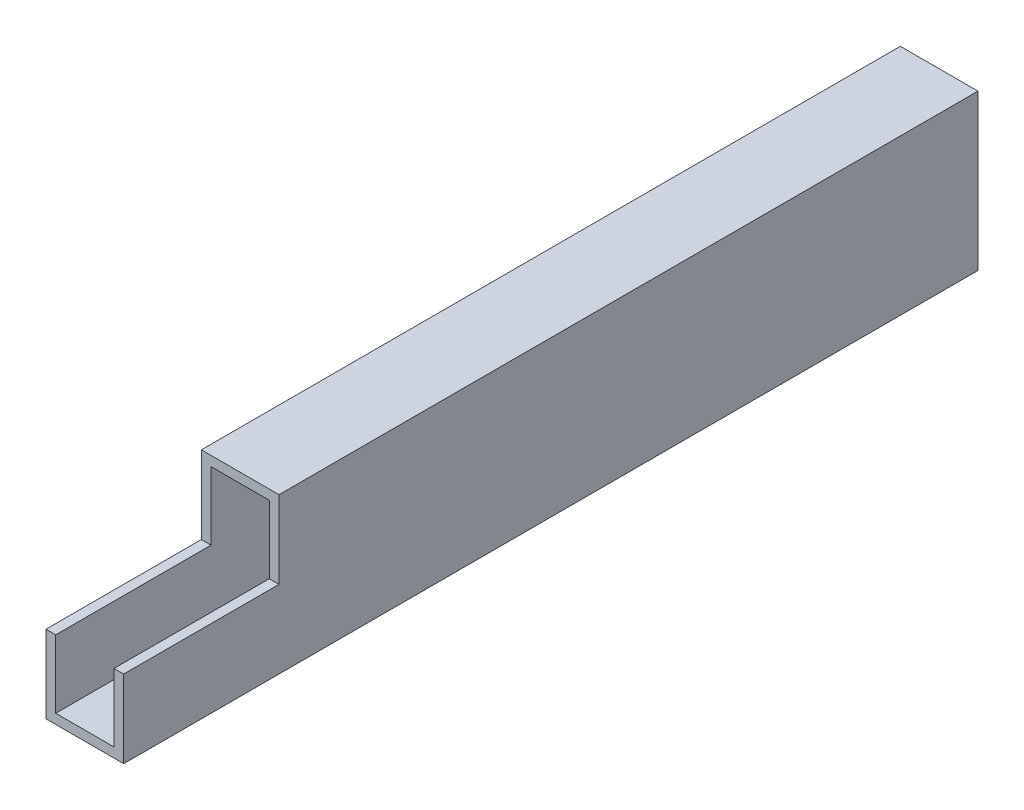
ISO-10303-21;
HEADER;
FILE_DESCRIPTION(('STEP AP214'),'2;1');
FILE_NAME('part.step','',(''),(''),'','','');
FILE_SCHEMA(('AUTOMOTIVE_DESIGN { 1 0 10303 214 1 1 1 1 }'));
ENDSEC;
DATA;
#1=APPLICATION_CONTEXT('core data for automotive mechanical design processes');
#2=APPLICATION_PROTOCOL_DEFINITION('international standard','automotive_design',2000,#1);
#3=PRODUCT_CONTEXT('',#1,'mechanical');
#4=PRODUCT('Part','Part','',(#3));
#5=PRODUCT_RELATED_PRODUCT_CATEGORY('part','',(#4));
#6=PRODUCT_DEFINITION_FORMATION('','',#4);
#7=PRODUCT_DEFINITION_CONTEXT('part definition',#1,'design');
#8=PRODUCT_DEFINITION('design','',#6,#7);
#9=PRODUCT_DEFINITION_SHAPE('','',#8);
#10=(LENGTH_UNIT() NAMED_UNIT(*) SI_UNIT(.MILLI.,.METRE.));
#11=(NAMED_UNIT(*) PLANE_ANGLE_UNIT() SI_UNIT($,.RADIAN.));
#12=(NAMED_UNIT(*) SI_UNIT($,.STERADIAN.) SOLID_ANGLE_UNIT());
#13=UNCERTAINTY_MEASURE_WITH_UNIT(LENGTH_MEASURE(1.E-05),#10,'distance_accuracy_value','');
#14=(GEOMETRIC_REPRESENTATION_CONTEXT(3) GLOBAL_UNCERTAINTY_ASSIGNED_CONTEXT((#13)) GLOBAL_UNIT_ASSIGNED_CONTEXT((#10,
#11,#12)) REPRESENTATION_CONTEXT('',''));
#15=CARTESIAN_POINT('',(0.,0.,0.));
#16=DIRECTION('',(0.,0.,1.));
#17=DIRECTION('',(1.,0.,0.));
#18=AXIS2_PLACEMENT_3D('',#15,#16,#17);
#19=CARTESIAN_POINT('',(0.,0.,279.4));
#20=DIRECTION('',(0.,0.,1.));
#21=DIRECTION('',(1.,0.,0.));
#22=AXIS2_PLACEMENT_3D('',#19,#20,#21);
#23=PLANE('',#22);
#24=DIRECTION('',(1.,0.,0.));
#25=VECTOR('',#24,1.);
#26=CARTESIAN_POINT('',(-56.7961266284947,-25.4,279.4));
#27=LINE('',#26,#25);
#28=CARTESIAN_POINT('',(0.,-25.4,279.4));
#29=VERTEX_POINT('',#28);
#30=CARTESIAN_POINT('',(3.175,-25.4,279.4));
#31=VERTEX_POINT('',#30);
#32=EDGE_CURVE('E134',#29,#31,#27,.T.);
#33=ORIENTED_EDGE('',*,*,#32,.F.);
#34=DIRECTION('',(0.,-1.,0.));
#35=VECTOR('',#34,1.);
#36=CARTESIAN_POINT('',(0.,0.,279.4));
#37=LINE('',#36,#35);
#38=CARTESIAN_POINT('',(0.,-50.8,279.4));
#39=VERTEX_POINT('',#38);
#40=EDGE_CURVE('E152',#29,#39,#37,.T.);
#41=ORIENTED_EDGE('',*,*,#40,.T.);
#42=DIRECTION('',(1.,0.,0.));
#43=VECTOR('',#42,1.);
#44=CARTESIAN_POINT('',(0.,-50.8,279.4));
#45=LINE('',#44,#43);
#46=CARTESIAN_POINT('',(25.4,-50.8,279.4));
#47=VERTEX_POINT('',#46);
#48=EDGE_CURVE('E146',#39,#47,#45,.T.);
#49=ORIENTED_EDGE('',*,*,#48,.T.);
#50=DIRECTION('',(0.,1.,0.));
#51=VECTOR('',#50,1.);
#52=CARTESIAN_POINT('',(25.4,0.,279.4));
#53=LINE('',#52,#51);
#54=CARTESIAN_POINT('',(25.4,-25.4,279.4));
#55=VERTEX_POINT('',#54);
#56=EDGE_CURVE('E142',#47,#55,#53,.T.);
#57=ORIENTED_EDGE('',*,*,#56,.T.);
#58=CARTESIAN_POINT('',(22.225,-25.4,279.4));
#59=VERTEX_POINT('',#58);
#60=EDGE_CURVE('E123',#59,#55,#27,.T.);
#61=ORIENTED_EDGE('',*,*,#60,.F.);
#62=DIRECTION('',(0.,1.,0.));
#63=VECTOR('',#62,1.);
#64=CARTESIAN_POINT('',(22.225,-3.175,279.4));
#65=LINE('',#64,#63);
#66=CARTESIAN_POINT('',(22.225,-47.625,279.4));
#67=VERTEX_POINT('',#66);
#68=EDGE_CURVE('E190',#67,#59,#65,.T.);
#69=ORIENTED_EDGE('',*,*,#68,.F.);
#70=DIRECTION('',(1.,0.,0.));
#71=VECTOR('',#70,1.);
#72=CARTESIAN_POINT('',(3.17500000000001,-47.625,279.4));
#73=LINE('',#72,#71);
#74=CARTESIAN_POINT('',(3.17500000000001,-47.625,279.4));
#75=VERTEX_POINT('',#74);
#76=EDGE_CURVE('E229',#75,#67,#73,.T.);
#77=ORIENTED_EDGE('',*,*,#76,.F.);
#78=DIRECTION('',(0.,-1.,0.));
#79=VECTOR('',#78,1.);
#80=CARTESIAN_POINT('',(3.175,-3.175,279.4));
#81=LINE('',#80,#79);
#82=EDGE_CURVE('E227',#31,#75,#81,.T.);
#83=ORIENTED_EDGE('',*,*,#82,.F.);
#84=EDGE_LOOP('',(#33,#41,#49,#57,#61,#69,#77,#83));
#85=FACE_BOUND('',#84,.T.);
#86=ADVANCED_FACE('F33',(#85),#23,.T.);
#87=CARTESIAN_POINT('',(0.,0.,0.));
#88=DIRECTION('',(0.,0.,1.));
#89=DIRECTION('',(1.,0.,0.));
#90=AXIS2_PLACEMENT_3D('',#87,#88,#89);
#91=PLANE('',#90);
#92=DIRECTION('',(0.,-1.,0.));
#93=VECTOR('',#92,1.);
#94=CARTESIAN_POINT('',(0.,0.,0.));
#95=LINE('',#94,#93);
#96=CARTESIAN_POINT('',(0.,0.,0.));
#97=VERTEX_POINT('',#96);
#98=CARTESIAN_POINT('',(0.,-50.8,0.));
#99=VERTEX_POINT('',#98);
#100=EDGE_CURVE('E156',#97,#99,#95,.T.);
#101=ORIENTED_EDGE('',*,*,#100,.F.);
#102=DIRECTION('',(-1.,0.,0.));
#103=VECTOR('',#102,1.);
#104=CARTESIAN_POINT('',(0.,0.,0.));
#105=LINE('',#104,#103);
#106=CARTESIAN_POINT('',(25.4,0.,0.));
#107=VERTEX_POINT('',#106);
#108=EDGE_CURVE('E165',#107,#97,#105,.T.);
#109=ORIENTED_EDGE('',*,*,#108,.F.);
#110=DIRECTION('',(0.,1.,0.));
#111=VECTOR('',#110,1.);
#112=CARTESIAN_POINT('',(25.4,0.,0.));
#113=LINE('',#112,#111);
#114=CARTESIAN_POINT('',(25.4,-50.8,0.));
#115=VERTEX_POINT('',#114);
#116=EDGE_CURVE('E162',#115,#107,#113,.T.);
#117=ORIENTED_EDGE('',*,*,#116,.F.);
#118=DIRECTION('',(1.,0.,0.));
#119=VECTOR('',#118,1.);
#120=CARTESIAN_POINT('',(0.,-50.8,0.));
#121=LINE('',#120,#119);
#122=EDGE_CURVE('E159',#99,#115,#121,.T.);
#123=ORIENTED_EDGE('',*,*,#122,.F.);
#124=EDGE_LOOP('',(#101,#109,#117,#123));
#125=FACE_BOUND('',#124,.T.);
#126=DIRECTION('',(0.,-1.,0.));
#127=VECTOR('',#126,1.);
#128=CARTESIAN_POINT('',(3.175,-3.175,0.));
#129=LINE('',#128,#127);
#130=CARTESIAN_POINT('',(3.175,-3.175,0.));
#131=VERTEX_POINT('',#130);
#132=CARTESIAN_POINT('',(3.17500000000001,-47.625,0.));
#133=VERTEX_POINT('',#132);
#134=EDGE_CURVE('E226',#131,#133,#129,.T.);
#135=ORIENTED_EDGE('',*,*,#134,.T.);
#136=DIRECTION('',(1.,0.,0.));
#137=VECTOR('',#136,1.);
#138=CARTESIAN_POINT('',(3.17500000000001,-47.625,0.));
#139=LINE('',#138,#137);
#140=CARTESIAN_POINT('',(22.225,-47.625,0.));
#141=VERTEX_POINT('',#140);
#142=EDGE_CURVE('E234',#133,#141,#139,.T.);
#143=ORIENTED_EDGE('',*,*,#142,.T.);
#144=DIRECTION('',(0.,1.,0.));
#145=VECTOR('',#144,1.);
#146=CARTESIAN_POINT('',(22.225,-3.175,0.));
#147=LINE('',#146,#145);
#148=CARTESIAN_POINT('',(22.225,-3.175,0.));
#149=VERTEX_POINT('',#148);
#150=EDGE_CURVE('E237',#141,#149,#147,.T.);
#151=ORIENTED_EDGE('',*,*,#150,.T.);
#152=DIRECTION('',(-1.,0.,0.));
#153=VECTOR('',#152,1.);
#154=CARTESIAN_POINT('',(3.175,-3.175,0.));
#155=LINE('',#154,#153);
#156=EDGE_CURVE('E185',#149,#131,#155,.T.);
#157=ORIENTED_EDGE('',*,*,#156,.T.);
#158=EDGE_LOOP('',(#135,#143,#151,#157));
#159=FACE_BOUND('',#158,.T.);
#160=ADVANCED_FACE('F207',(#125,#159),#91,.F.);
#161=CARTESIAN_POINT('',(0.,0.,279.4));
#162=DIRECTION('',(1.,0.,0.));
#163=DIRECTION('',(0.,0.,-1.));
#164=AXIS2_PLACEMENT_3D('',#161,#162,#163);
#165=PLANE('',#164);
#166=DIRECTION('',(0.,0.,1.));
#167=VECTOR('',#166,1.);
#168=CARTESIAN_POINT('',(0.,-25.4,279.4));
#169=LINE('',#168,#167);
#170=CARTESIAN_POINT('',(0.,-25.4,228.6));
#171=VERTEX_POINT('',#170);
#172=EDGE_CURVE('E181',#171,#29,#169,.T.);
#173=ORIENTED_EDGE('',*,*,#172,.F.);
#174=DIRECTION('',(0.,-1.,0.));
#175=VECTOR('',#174,1.);
#176=CARTESIAN_POINT('',(0.,0.,228.6));
#177=LINE('',#176,#175);
#178=CARTESIAN_POINT('',(0.,0.,228.6));
#179=VERTEX_POINT('',#178);
#180=EDGE_CURVE('E214',#179,#171,#177,.T.);
#181=ORIENTED_EDGE('',*,*,#180,.F.);
#182=DIRECTION('',(0.,0.,-1.));
#183=VECTOR('',#182,1.);
#184=CARTESIAN_POINT('',(0.,0.,279.4));
#185=LINE('',#184,#183);
#186=EDGE_CURVE('E148',#179,#97,#185,.T.);
#187=ORIENTED_EDGE('',*,*,#186,.T.);
#188=ORIENTED_EDGE('',*,*,#100,.T.);
#189=DIRECTION('',(0.,0.,-1.));
#190=VECTOR('',#189,1.);
#191=CARTESIAN_POINT('',(0.,-50.8,279.4));
#192=LINE('',#191,#190);
#193=EDGE_CURVE('E171',#39,#99,#192,.T.);
#194=ORIENTED_EDGE('',*,*,#193,.F.);
#195=ORIENTED_EDGE('',*,*,#40,.F.);
#196=EDGE_LOOP('',(#173,#181,#187,#188,#194,#195));
#197=FACE_BOUND('',#196,.T.);
#198=ADVANCED_FACE('F35',(#197),#165,.F.);
#199=CARTESIAN_POINT('',(0.,-50.8,279.4));
#200=DIRECTION('',(0.,1.,0.));
#201=DIRECTION('',(0.,0.,1.));
#202=AXIS2_PLACEMENT_3D('',#199,#200,#201);
#203=PLANE('',#202);
#204=ORIENTED_EDGE('',*,*,#122,.T.);
#205=DIRECTION('',(0.,0.,-1.));
#206=VECTOR('',#205,1.);
#207=CARTESIAN_POINT('',(25.4,-50.8,279.4));
#208=LINE('',#207,#206);
#209=EDGE_CURVE('E169',#47,#115,#208,.T.);
#210=ORIENTED_EDGE('',*,*,#209,.F.);
#211=ORIENTED_EDGE('',*,*,#48,.F.);
#212=ORIENTED_EDGE('',*,*,#193,.T.);
#213=EDGE_LOOP('',(#204,#210,#211,#212));
#214=FACE_BOUND('',#213,.T.);
#215=ADVANCED_FACE('F201',(#214),#203,.F.);
#216=CARTESIAN_POINT('',(25.4,0.,279.4));
#217=DIRECTION('',(-1.,0.,0.));
#218=DIRECTION('',(0.,-1.,0.));
#219=AXIS2_PLACEMENT_3D('',#216,#217,#218);
#220=PLANE('',#219);
#221=DIRECTION('',(0.,0.,-1.));
#222=VECTOR('',#221,1.);
#223=CARTESIAN_POINT('',(25.4,0.,279.4));
#224=LINE('',#223,#222);
#225=CARTESIAN_POINT('',(25.4,0.,228.6));
#226=VERTEX_POINT('',#225);
#227=EDGE_CURVE('E150',#226,#107,#224,.T.);
#228=ORIENTED_EDGE('',*,*,#227,.F.);
#229=DIRECTION('',(0.,1.,0.));
#230=VECTOR('',#229,1.);
#231=CARTESIAN_POINT('',(25.4,0.,228.6));
#232=LINE('',#231,#230);
#233=CARTESIAN_POINT('',(25.4,-25.4,228.6));
#234=VERTEX_POINT('',#233);
#235=EDGE_CURVE('E135',#234,#226,#232,.T.);
#236=ORIENTED_EDGE('',*,*,#235,.F.);
#237=DIRECTION('',(0.,0.,-1.));
#238=VECTOR('',#237,1.);
#239=CARTESIAN_POINT('',(25.4,-25.4,279.4));
#240=LINE('',#239,#238);
#241=EDGE_CURVE('E127',#55,#234,#240,.T.);
#242=ORIENTED_EDGE('',*,*,#241,.F.);
#243=ORIENTED_EDGE('',*,*,#56,.F.);
#244=ORIENTED_EDGE('',*,*,#209,.T.);
#245=ORIENTED_EDGE('',*,*,#116,.T.);
#246=EDGE_LOOP('',(#228,#236,#242,#243,#244,#245));
#247=FACE_BOUND('',#246,.T.);
#248=ADVANCED_FACE('F140',(#247),#220,.F.);
#249=CARTESIAN_POINT('',(0.,0.,279.4));
#250=DIRECTION('',(0.,-1.,0.));
#251=DIRECTION('',(0.,0.,-1.));
#252=AXIS2_PLACEMENT_3D('',#249,#250,#251);
#253=PLANE('',#252);
#254=ORIENTED_EDGE('',*,*,#186,.F.);
#255=DIRECTION('',(1.,0.,0.));
#256=VECTOR('',#255,1.);
#257=CARTESIAN_POINT('',(-56.7961266284947,0.,228.6));
#258=LINE('',#257,#256);
#259=EDGE_CURVE('E213',#179,#226,#258,.T.);
#260=ORIENTED_EDGE('',*,*,#259,.T.);
#261=ORIENTED_EDGE('',*,*,#227,.T.);
#262=ORIENTED_EDGE('',*,*,#108,.T.);
#263=EDGE_LOOP('',(#254,#260,#261,#262));
#264=FACE_BOUND('',#263,.T.);
#265=ADVANCED_FACE('F212',(#264),#253,.F.);
#266=CARTESIAN_POINT('',(3.175,-3.175,279.4));
#267=DIRECTION('',(1.,0.,0.));
#268=DIRECTION('',(0.,1.,0.));
#269=AXIS2_PLACEMENT_3D('',#266,#267,#268);
#270=PLANE('',#269);
#271=DIRECTION('',(0.,1.,0.));
#272=VECTOR('',#271,1.);
#273=CARTESIAN_POINT('',(3.175,-3.175,228.6));
#274=LINE('',#273,#272);
#275=CARTESIAN_POINT('',(3.175,-25.4,228.6));
#276=VERTEX_POINT('',#275);
#277=CARTESIAN_POINT('',(3.175,-3.175,228.6));
#278=VERTEX_POINT('',#277);
#279=EDGE_CURVE('E48',#276,#278,#274,.T.);
#280=ORIENTED_EDGE('',*,*,#279,.F.);
#281=DIRECTION('',(0.,0.,-1.));
#282=VECTOR('',#281,1.);
#283=CARTESIAN_POINT('',(3.175,-25.4,279.4));
#284=LINE('',#283,#282);
#285=EDGE_CURVE('E224',#31,#276,#284,.T.);
#286=ORIENTED_EDGE('',*,*,#285,.F.);
#287=ORIENTED_EDGE('',*,*,#82,.T.);
#288=DIRECTION('',(0.,0.,-1.));
#289=VECTOR('',#288,1.);
#290=CARTESIAN_POINT('',(3.17500000000001,-47.625,279.4));
#291=LINE('',#290,#289);
#292=EDGE_CURVE('E160',#75,#133,#291,.T.);
#293=ORIENTED_EDGE('',*,*,#292,.T.);
#294=ORIENTED_EDGE('',*,*,#134,.F.);
#295=DIRECTION('',(0.,0.,-1.));
#296=VECTOR('',#295,1.);
#297=CARTESIAN_POINT('',(3.175,-3.175,279.4));
#298=LINE('',#297,#296);
#299=EDGE_CURVE('E55',#278,#131,#298,.T.);
#300=ORIENTED_EDGE('',*,*,#299,.F.);
#301=EDGE_LOOP('',(#280,#286,#287,#293,#294,#300));
#302=FACE_BOUND('',#301,.T.);
#303=ADVANCED_FACE('F244',(#302),#270,.T.);
#304=CARTESIAN_POINT('',(3.17500000000001,-47.625,279.4));
#305=DIRECTION('',(0.,1.,0.));
#306=DIRECTION('',(0.,0.,1.));
#307=AXIS2_PLACEMENT_3D('',#304,#305,#306);
#308=PLANE('',#307);
#309=ORIENTED_EDGE('',*,*,#142,.F.);
#310=ORIENTED_EDGE('',*,*,#292,.F.);
#311=ORIENTED_EDGE('',*,*,#76,.T.);
#312=DIRECTION('',(0.,0.,-1.));
#313=VECTOR('',#312,1.);
#314=CARTESIAN_POINT('',(22.225,-47.625,279.4));
#315=LINE('',#314,#313);
#316=EDGE_CURVE('E187',#67,#141,#315,.T.);
#317=ORIENTED_EDGE('',*,*,#316,.T.);
#318=EDGE_LOOP('',(#309,#310,#311,#317));
#319=FACE_BOUND('',#318,.T.);
#320=ADVANCED_FACE('F242',(#319),#308,.T.);
#321=CARTESIAN_POINT('',(22.225,-3.175,279.4));
#322=DIRECTION('',(-1.,0.,0.));
#323=DIRECTION('',(0.,-1.,0.));
#324=AXIS2_PLACEMENT_3D('',#321,#322,#323);
#325=PLANE('',#324);
#326=DIRECTION('',(0.,-1.,0.));
#327=VECTOR('',#326,1.);
#328=CARTESIAN_POINT('',(22.225,-3.175,228.6));
#329=LINE('',#328,#327);
#330=CARTESIAN_POINT('',(22.225,-3.175,228.6));
#331=VERTEX_POINT('',#330);
#332=CARTESIAN_POINT('',(22.225,-25.4,228.6));
#333=VERTEX_POINT('',#332);
#334=EDGE_CURVE('E175',#331,#333,#329,.T.);
#335=ORIENTED_EDGE('',*,*,#334,.F.);
#336=DIRECTION('',(0.,0.,-1.));
#337=VECTOR('',#336,1.);
#338=CARTESIAN_POINT('',(22.225,-3.175,279.4));
#339=LINE('',#338,#337);
#340=EDGE_CURVE('E180',#331,#149,#339,.T.);
#341=ORIENTED_EDGE('',*,*,#340,.T.);
#342=ORIENTED_EDGE('',*,*,#150,.F.);
#343=ORIENTED_EDGE('',*,*,#316,.F.);
#344=ORIENTED_EDGE('',*,*,#68,.T.);
#345=DIRECTION('',(0.,0.,1.));
#346=VECTOR('',#345,1.);
#347=CARTESIAN_POINT('',(22.225,-25.4,279.4));
#348=LINE('',#347,#346);
#349=EDGE_CURVE('E11',#333,#59,#348,.T.);
#350=ORIENTED_EDGE('',*,*,#349,.F.);
#351=EDGE_LOOP('',(#335,#341,#342,#343,#344,#350));
#352=FACE_BOUND('',#351,.T.);
#353=ADVANCED_FACE('F178',(#352),#325,.T.);
#354=CARTESIAN_POINT('',(3.175,-3.175,279.4));
#355=DIRECTION('',(0.,-1.,0.));
#356=DIRECTION('',(0.,0.,-1.));
#357=AXIS2_PLACEMENT_3D('',#354,#355,#356);
#358=PLANE('',#357);
#359=DIRECTION('',(1.,0.,0.));
#360=VECTOR('',#359,1.);
#361=CARTESIAN_POINT('',(3.175,-3.175,228.6));
#362=LINE('',#361,#360);
#363=EDGE_CURVE('E41',#278,#331,#362,.T.);
#364=ORIENTED_EDGE('',*,*,#363,.F.);
#365=ORIENTED_EDGE('',*,*,#299,.T.);
#366=ORIENTED_EDGE('',*,*,#156,.F.);
#367=ORIENTED_EDGE('',*,*,#340,.F.);
#368=EDGE_LOOP('',(#364,#365,#366,#367));
#369=FACE_BOUND('',#368,.T.);
#370=ADVANCED_FACE('F183',(#369),#358,.T.);
#371=CARTESIAN_POINT('',(-56.7961266284947,-25.4,279.4));
#372=DIRECTION('',(0.,-1.,0.));
#373=DIRECTION('',(1.,0.,0.));
#374=AXIS2_PLACEMENT_3D('',#371,#372,#373);
#375=PLANE('',#374);
#376=ORIENTED_EDGE('',*,*,#285,.T.);
#377=DIRECTION('',(1.,0.,0.));
#378=VECTOR('',#377,1.);
#379=CARTESIAN_POINT('',(-56.7961266284947,-25.4,228.6));
#380=LINE('',#379,#378);
#381=EDGE_CURVE('E215',#171,#276,#380,.T.);
#382=ORIENTED_EDGE('',*,*,#381,.F.);
#383=ORIENTED_EDGE('',*,*,#172,.T.);
#384=ORIENTED_EDGE('',*,*,#32,.T.);
#385=EDGE_LOOP('',(#376,#382,#383,#384));
#386=FACE_BOUND('',#385,.T.);
#387=ADVANCED_FACE('F248',(#386),#375,.F.);
#388=CARTESIAN_POINT('',(-56.7961266284947,0.,228.6));
#389=DIRECTION('',(0.,0.,-1.));
#390=DIRECTION('',(-1.,0.,0.));
#391=AXIS2_PLACEMENT_3D('',#388,#389,#390);
#392=PLANE('',#391);
#393=ORIENTED_EDGE('',*,*,#279,.T.);
#394=ORIENTED_EDGE('',*,*,#363,.T.);
#395=ORIENTED_EDGE('',*,*,#334,.T.);
#396=EDGE_CURVE('E218',#333,#234,#380,.T.);
#397=ORIENTED_EDGE('',*,*,#396,.T.);
#398=ORIENTED_EDGE('',*,*,#235,.T.);
#399=ORIENTED_EDGE('',*,*,#259,.F.);
#400=ORIENTED_EDGE('',*,*,#180,.T.);
#401=ORIENTED_EDGE('',*,*,#381,.T.);
#402=EDGE_LOOP('',(#393,#394,#395,#397,#398,#399,#400,#401));
#403=FACE_BOUND('',#402,.T.);
#404=ADVANCED_FACE('F174',(#403),#392,.F.);
#405=ORIENTED_EDGE('',*,*,#349,.T.);
#406=ORIENTED_EDGE('',*,*,#60,.T.);
#407=ORIENTED_EDGE('',*,*,#241,.T.);
#408=ORIENTED_EDGE('',*,*,#396,.F.);
#409=EDGE_LOOP('',(#405,#406,#407,#408));
#410=FACE_BOUND('',#409,.T.);
#411=ADVANCED_FACE('F125',(#410),#375,.F.);
#412=CLOSED_SHELL('',(#86,#160,#198,#215,#248,#265,#303,#320,#353,#370,#387,#404,#411));
#413=MANIFOLD_SOLID_BREP('B2',#412);
#414=ADVANCED_BREP_SHAPE_REPRESENTATION('',(#18,#413),#14);
#415=SHAPE_DEFINITION_REPRESENTATION(#9,#414);
ENDSEC;
END-ISO-10303-21;
